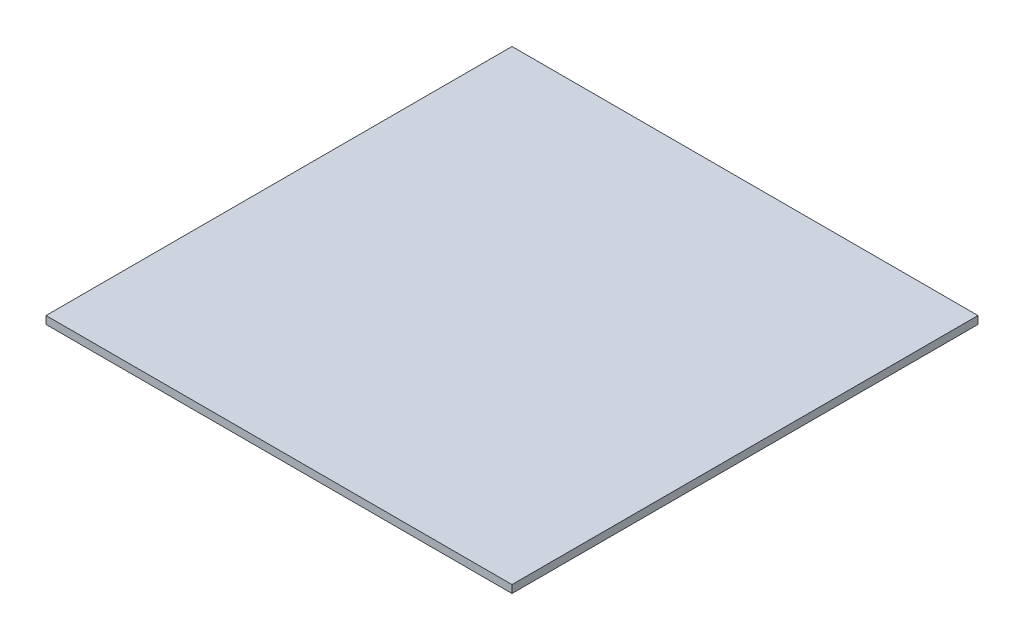
ISO-10303-21;
HEADER;
FILE_DESCRIPTION(('STEP AP214'),'2;1');
FILE_NAME('part.step','',(''),(''),'','','');
FILE_SCHEMA(('AUTOMOTIVE_DESIGN { 1 0 10303 214 1 1 1 1 }'));
ENDSEC;
DATA;
#1=APPLICATION_CONTEXT('core data for automotive mechanical design processes');
#2=APPLICATION_PROTOCOL_DEFINITION('international standard','automotive_design',2000,#1);
#3=PRODUCT_CONTEXT('',#1,'mechanical');
#4=PRODUCT('Part','Part','',(#3));
#5=PRODUCT_RELATED_PRODUCT_CATEGORY('part','',(#4));
#6=PRODUCT_DEFINITION_FORMATION('','',#4);
#7=PRODUCT_DEFINITION_CONTEXT('part definition',#1,'design');
#8=PRODUCT_DEFINITION('design','',#6,#7);
#9=PRODUCT_DEFINITION_SHAPE('','',#8);
#10=(LENGTH_UNIT() NAMED_UNIT(*) SI_UNIT(.MILLI.,.METRE.));
#11=(NAMED_UNIT(*) PLANE_ANGLE_UNIT() SI_UNIT($,.RADIAN.));
#12=(NAMED_UNIT(*) SI_UNIT($,.STERADIAN.) SOLID_ANGLE_UNIT());
#13=UNCERTAINTY_MEASURE_WITH_UNIT(LENGTH_MEASURE(1.E-05),#10,'distance_accuracy_value','');
#14=(GEOMETRIC_REPRESENTATION_CONTEXT(3) GLOBAL_UNCERTAINTY_ASSIGNED_CONTEXT((#13)) GLOBAL_UNIT_ASSIGNED_CONTEXT((#10,
#11,#12)) REPRESENTATION_CONTEXT('',''));
#15=CARTESIAN_POINT('',(0.,0.,0.));
#16=DIRECTION('',(0.,0.,1.));
#17=DIRECTION('',(1.,0.,0.));
#18=AXIS2_PLACEMENT_3D('',#15,#16,#17);
#19=CARTESIAN_POINT('',(-9.,0.3,-9.));
#20=DIRECTION('',(1.,0.,0.));
#21=DIRECTION('',(0.,0.,-1.));
#22=AXIS2_PLACEMENT_3D('',#19,#20,#21);
#23=PLANE('',#22);
#24=DIRECTION('',(0.,0.,1.));
#25=VECTOR('',#24,1.);
#26=CARTESIAN_POINT('',(-9.,0.,-9.));
#27=LINE('',#26,#25);
#28=CARTESIAN_POINT('',(-9.,0.,-9.));
#29=VERTEX_POINT('',#28);
#30=CARTESIAN_POINT('',(-8.99999999999999,0.,9.));
#31=VERTEX_POINT('',#30);
#32=EDGE_CURVE('E100',#29,#31,#27,.T.);
#33=ORIENTED_EDGE('',*,*,#32,.T.);
#34=DIRECTION('',(0.,-1.,0.));
#35=VECTOR('',#34,1.);
#36=CARTESIAN_POINT('',(-8.99999999999999,0.3,9.));
#37=LINE('',#36,#35);
#38=CARTESIAN_POINT('',(-8.99999999999999,0.3,9.));
#39=VERTEX_POINT('',#38);
#40=EDGE_CURVE('E11',#39,#31,#37,.T.);
#41=ORIENTED_EDGE('',*,*,#40,.F.);
#42=DIRECTION('',(0.,0.,1.));
#43=VECTOR('',#42,1.);
#44=CARTESIAN_POINT('',(-9.,0.3,-9.));
#45=LINE('',#44,#43);
#46=CARTESIAN_POINT('',(-9.,0.3,-9.));
#47=VERTEX_POINT('',#46);
#48=EDGE_CURVE('E88',#47,#39,#45,.T.);
#49=ORIENTED_EDGE('',*,*,#48,.F.);
#50=DIRECTION('',(0.,-1.,0.));
#51=VECTOR('',#50,1.);
#52=CARTESIAN_POINT('',(-9.,0.3,-9.));
#53=LINE('',#52,#51);
#54=EDGE_CURVE('E96',#47,#29,#53,.T.);
#55=ORIENTED_EDGE('',*,*,#54,.T.);
#56=EDGE_LOOP('',(#33,#41,#49,#55));
#57=FACE_BOUND('',#56,.T.);
#58=ADVANCED_FACE('F37',(#57),#23,.F.);
#59=CARTESIAN_POINT('',(9.00000000000001,0.3,9.));
#60=DIRECTION('',(0.,0.,-1.));
#61=DIRECTION('',(-1.,0.,0.));
#62=AXIS2_PLACEMENT_3D('',#59,#60,#61);
#63=PLANE('',#62);
#64=DIRECTION('',(1.,0.,0.));
#65=VECTOR('',#64,1.);
#66=CARTESIAN_POINT('',(9.00000000000001,0.,9.));
#67=LINE('',#66,#65);
#68=CARTESIAN_POINT('',(9.00000000000001,0.,9.));
#69=VERTEX_POINT('',#68);
#70=EDGE_CURVE('E92',#31,#69,#67,.T.);
#71=ORIENTED_EDGE('',*,*,#70,.T.);
#72=DIRECTION('',(0.,-1.,0.));
#73=VECTOR('',#72,1.);
#74=CARTESIAN_POINT('',(9.00000000000001,0.3,9.));
#75=LINE('',#74,#73);
#76=CARTESIAN_POINT('',(9.00000000000001,0.3,9.));
#77=VERTEX_POINT('',#76);
#78=EDGE_CURVE('E45',#77,#69,#75,.T.);
#79=ORIENTED_EDGE('',*,*,#78,.F.);
#80=DIRECTION('',(1.,0.,0.));
#81=VECTOR('',#80,1.);
#82=CARTESIAN_POINT('',(9.00000000000001,0.3,9.));
#83=LINE('',#82,#81);
#84=EDGE_CURVE('E83',#39,#77,#83,.T.);
#85=ORIENTED_EDGE('',*,*,#84,.F.);
#86=ORIENTED_EDGE('',*,*,#40,.T.);
#87=EDGE_LOOP('',(#71,#79,#85,#86));
#88=FACE_BOUND('',#87,.T.);
#89=ADVANCED_FACE('F91',(#88),#63,.F.);
#90=CARTESIAN_POINT('',(9.,0.3,-9.));
#91=DIRECTION('',(-1.,0.,0.));
#92=DIRECTION('',(0.,0.,1.));
#93=AXIS2_PLACEMENT_3D('',#90,#91,#92);
#94=PLANE('',#93);
#95=DIRECTION('',(0.,0.,-1.));
#96=VECTOR('',#95,1.);
#97=CARTESIAN_POINT('',(9.,0.,-9.));
#98=LINE('',#97,#96);
#99=CARTESIAN_POINT('',(9.,0.,-9.));
#100=VERTEX_POINT('',#99);
#101=EDGE_CURVE('E70',#69,#100,#98,.T.);
#102=ORIENTED_EDGE('',*,*,#101,.T.);
#103=DIRECTION('',(0.,-1.,0.));
#104=VECTOR('',#103,1.);
#105=CARTESIAN_POINT('',(9.,0.3,-9.));
#106=LINE('',#105,#104);
#107=CARTESIAN_POINT('',(9.,0.3,-9.));
#108=VERTEX_POINT('',#107);
#109=EDGE_CURVE('E93',#108,#100,#106,.T.);
#110=ORIENTED_EDGE('',*,*,#109,.F.);
#111=DIRECTION('',(0.,0.,-1.));
#112=VECTOR('',#111,1.);
#113=CARTESIAN_POINT('',(9.,0.3,-9.));
#114=LINE('',#113,#112);
#115=EDGE_CURVE('E86',#77,#108,#114,.T.);
#116=ORIENTED_EDGE('',*,*,#115,.F.);
#117=ORIENTED_EDGE('',*,*,#78,.T.);
#118=EDGE_LOOP('',(#102,#110,#116,#117));
#119=FACE_BOUND('',#118,.T.);
#120=ADVANCED_FACE('F94',(#119),#94,.F.);
#121=CARTESIAN_POINT('',(9.,0.3,-9.));
#122=DIRECTION('',(0.,0.,1.));
#123=DIRECTION('',(1.,0.,0.));
#124=AXIS2_PLACEMENT_3D('',#121,#122,#123);
#125=PLANE('',#124);
#126=DIRECTION('',(-1.,0.,0.));
#127=VECTOR('',#126,1.);
#128=CARTESIAN_POINT('',(9.,0.,-9.));
#129=LINE('',#128,#127);
#130=EDGE_CURVE('E76',#100,#29,#129,.T.);
#131=ORIENTED_EDGE('',*,*,#130,.T.);
#132=ORIENTED_EDGE('',*,*,#54,.F.);
#133=DIRECTION('',(-1.,0.,0.));
#134=VECTOR('',#133,1.);
#135=CARTESIAN_POINT('',(9.,0.3,-9.));
#136=LINE('',#135,#134);
#137=EDGE_CURVE('E53',#108,#47,#136,.T.);
#138=ORIENTED_EDGE('',*,*,#137,.F.);
#139=ORIENTED_EDGE('',*,*,#109,.T.);
#140=EDGE_LOOP('',(#131,#132,#138,#139));
#141=FACE_BOUND('',#140,.T.);
#142=ADVANCED_FACE('F107',(#141),#125,.F.);
#143=CARTESIAN_POINT('',(0.,0.3,0.));
#144=DIRECTION('',(0.,-1.,0.));
#145=DIRECTION('',(0.,0.,-1.));
#146=AXIS2_PLACEMENT_3D('',#143,#144,#145);
#147=PLANE('',#146);
#148=ORIENTED_EDGE('',*,*,#48,.T.);
#149=ORIENTED_EDGE('',*,*,#84,.T.);
#150=ORIENTED_EDGE('',*,*,#115,.T.);
#151=ORIENTED_EDGE('',*,*,#137,.T.);
#152=EDGE_LOOP('',(#148,#149,#150,#151));
#153=FACE_BOUND('',#152,.T.);
#154=ADVANCED_FACE('F84',(#153),#147,.F.);
#155=CARTESIAN_POINT('',(0.,0.,0.));
#156=DIRECTION('',(0.,-1.,0.));
#157=DIRECTION('',(0.,0.,-1.));
#158=AXIS2_PLACEMENT_3D('',#155,#156,#157);
#159=PLANE('',#158);
#160=ORIENTED_EDGE('',*,*,#32,.F.);
#161=ORIENTED_EDGE('',*,*,#130,.F.);
#162=ORIENTED_EDGE('',*,*,#101,.F.);
#163=ORIENTED_EDGE('',*,*,#70,.F.);
#164=EDGE_LOOP('',(#160,#161,#162,#163));
#165=FACE_BOUND('',#164,.T.);
#166=ADVANCED_FACE('F110',(#165),#159,.T.);
#167=CLOSED_SHELL('',(#58,#89,#120,#142,#154,#166));
#168=MANIFOLD_SOLID_BREP('B2',#167);
#169=ADVANCED_BREP_SHAPE_REPRESENTATION('',(#18,#168),#14);
#170=SHAPE_DEFINITION_REPRESENTATION(#9,#169);
ENDSEC;
END-ISO-10303-21;
